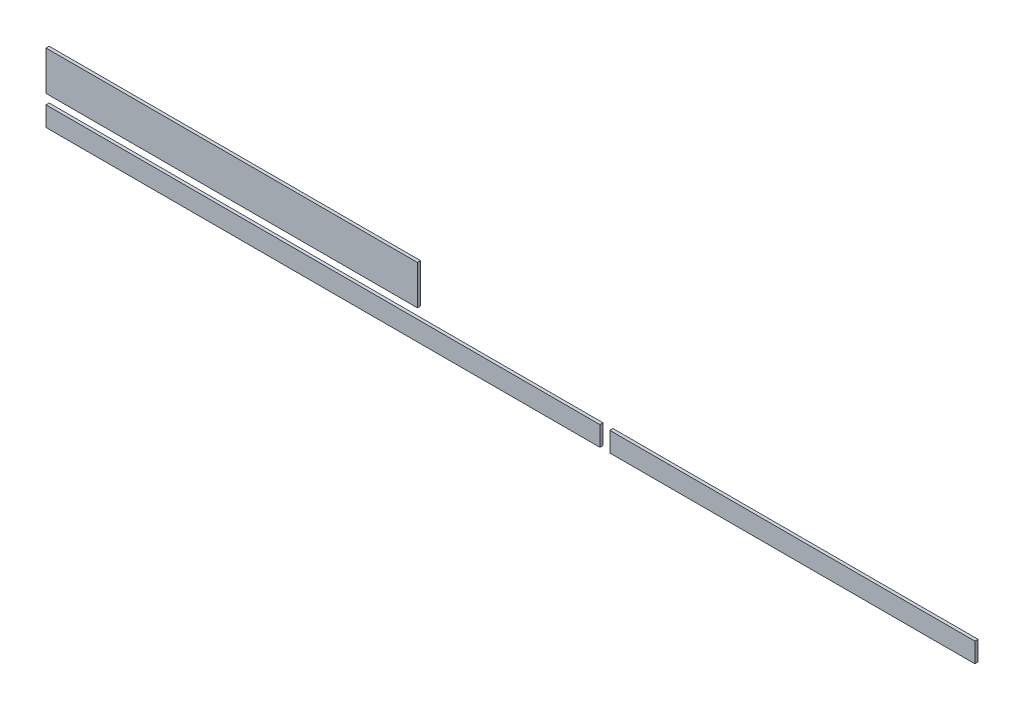
ISO-10303-21;
HEADER;
FILE_DESCRIPTION(('STEP AP214'),'2;1');
FILE_NAME('part.step','',(''),(''),'','','');
FILE_SCHEMA(('AUTOMOTIVE_DESIGN { 1 0 10303 214 1 1 1 1 }'));
ENDSEC;
DATA;
#1=APPLICATION_CONTEXT('core data for automotive mechanical design processes');
#2=APPLICATION_PROTOCOL_DEFINITION('international standard','automotive_design',2000,#1);
#3=PRODUCT_CONTEXT('',#1,'mechanical');
#4=PRODUCT('Part','Part','',(#3));
#5=PRODUCT_RELATED_PRODUCT_CATEGORY('part','',(#4));
#6=PRODUCT_DEFINITION_FORMATION('','',#4);
#7=PRODUCT_DEFINITION_CONTEXT('part definition',#1,'design');
#8=PRODUCT_DEFINITION('design','',#6,#7);
#9=PRODUCT_DEFINITION_SHAPE('','',#8);
#10=(LENGTH_UNIT() NAMED_UNIT(*) SI_UNIT(.MILLI.,.METRE.));
#11=(NAMED_UNIT(*) PLANE_ANGLE_UNIT() SI_UNIT($,.RADIAN.));
#12=(NAMED_UNIT(*) SI_UNIT($,.STERADIAN.) SOLID_ANGLE_UNIT());
#13=UNCERTAINTY_MEASURE_WITH_UNIT(LENGTH_MEASURE(1.E-05),#10,'distance_accuracy_value','');
#14=(GEOMETRIC_REPRESENTATION_CONTEXT(3) GLOBAL_UNCERTAINTY_ASSIGNED_CONTEXT((#13)) GLOBAL_UNIT_ASSIGNED_CONTEXT((#10,
#11,#12)) REPRESENTATION_CONTEXT('',''));
#15=CARTESIAN_POINT('',(0.,0.,0.));
#16=DIRECTION('',(0.,0.,1.));
#17=DIRECTION('',(1.,0.,0.));
#18=AXIS2_PLACEMENT_3D('',#15,#16,#17);
#19=CARTESIAN_POINT('',(0.,15.,1.5875));
#20=DIRECTION('',(1.,0.,0.));
#21=DIRECTION('',(0.,0.,-1.));
#22=AXIS2_PLACEMENT_3D('',#19,#20,#21);
#23=PLANE('',#22);
#24=DIRECTION('',(0.,-1.,0.));
#25=VECTOR('',#24,1.);
#26=CARTESIAN_POINT('',(0.,15.,0.));
#27=LINE('',#26,#25);
#28=CARTESIAN_POINT('',(0.,35.,0.));
#29=VERTEX_POINT('',#28);
#30=CARTESIAN_POINT('',(0.,15.,0.));
#31=VERTEX_POINT('',#30);
#32=EDGE_CURVE('E12',#29,#31,#27,.T.);
#33=ORIENTED_EDGE('',*,*,#32,.T.);
#34=DIRECTION('',(0.,0.,-1.));
#35=VECTOR('',#34,1.);
#36=CARTESIAN_POINT('',(0.,15.,1.5875));
#37=LINE('',#36,#35);
#38=CARTESIAN_POINT('',(0.,15.,1.5875));
#39=VERTEX_POINT('',#38);
#40=EDGE_CURVE('E136',#39,#31,#37,.T.);
#41=ORIENTED_EDGE('',*,*,#40,.F.);
#42=DIRECTION('',(0.,-1.,0.));
#43=VECTOR('',#42,1.);
#44=CARTESIAN_POINT('',(0.,15.,1.5875));
#45=LINE('',#44,#43);
#46=CARTESIAN_POINT('',(0.,35.,1.5875));
#47=VERTEX_POINT('',#46);
#48=EDGE_CURVE('E60',#47,#39,#45,.T.);
#49=ORIENTED_EDGE('',*,*,#48,.F.);
#50=DIRECTION('',(0.,0.,-1.));
#51=VECTOR('',#50,1.);
#52=CARTESIAN_POINT('',(0.,35.,1.5875));
#53=LINE('',#52,#51);
#54=EDGE_CURVE('E118',#47,#29,#53,.T.);
#55=ORIENTED_EDGE('',*,*,#54,.T.);
#56=EDGE_LOOP('',(#33,#41,#49,#55));
#57=FACE_BOUND('',#56,.T.);
#58=ADVANCED_FACE('F56',(#57),#23,.F.);
#59=CARTESIAN_POINT('',(188.71,15.,1.5875));
#60=DIRECTION('',(0.,1.,0.));
#61=DIRECTION('',(-1.,0.,0.));
#62=AXIS2_PLACEMENT_3D('',#59,#60,#61);
#63=PLANE('',#62);
#64=DIRECTION('',(1.,0.,0.));
#65=VECTOR('',#64,1.);
#66=CARTESIAN_POINT('',(188.71,15.,0.));
#67=LINE('',#66,#65);
#68=CARTESIAN_POINT('',(188.71,15.,0.));
#69=VERTEX_POINT('',#68);
#70=EDGE_CURVE('E67',#31,#69,#67,.T.);
#71=ORIENTED_EDGE('',*,*,#70,.T.);
#72=DIRECTION('',(0.,0.,-1.));
#73=VECTOR('',#72,1.);
#74=CARTESIAN_POINT('',(188.71,15.,1.5875));
#75=LINE('',#74,#73);
#76=CARTESIAN_POINT('',(188.71,15.,1.5875));
#77=VERTEX_POINT('',#76);
#78=EDGE_CURVE('E112',#77,#69,#75,.T.);
#79=ORIENTED_EDGE('',*,*,#78,.F.);
#80=DIRECTION('',(1.,0.,0.));
#81=VECTOR('',#80,1.);
#82=CARTESIAN_POINT('',(188.71,15.,1.5875));
#83=LINE('',#82,#81);
#84=EDGE_CURVE('E91',#39,#77,#83,.T.);
#85=ORIENTED_EDGE('',*,*,#84,.F.);
#86=ORIENTED_EDGE('',*,*,#40,.T.);
#87=EDGE_LOOP('',(#71,#79,#85,#86));
#88=FACE_BOUND('',#87,.T.);
#89=ADVANCED_FACE('F140',(#88),#63,.F.);
#90=CARTESIAN_POINT('',(188.71,15.,1.5875));
#91=DIRECTION('',(-1.,0.,0.));
#92=DIRECTION('',(0.,0.,1.));
#93=AXIS2_PLACEMENT_3D('',#90,#91,#92);
#94=PLANE('',#93);
#95=DIRECTION('',(0.,1.,0.));
#96=VECTOR('',#95,1.);
#97=CARTESIAN_POINT('',(188.71,15.,0.));
#98=LINE('',#97,#96);
#99=CARTESIAN_POINT('',(188.71,35.,0.));
#100=VERTEX_POINT('',#99);
#101=EDGE_CURVE('E107',#69,#100,#98,.T.);
#102=ORIENTED_EDGE('',*,*,#101,.T.);
#103=DIRECTION('',(0.,0.,-1.));
#104=VECTOR('',#103,1.);
#105=CARTESIAN_POINT('',(188.71,35.,1.5875));
#106=LINE('',#105,#104);
#107=CARTESIAN_POINT('',(188.71,35.,1.5875));
#108=VERTEX_POINT('',#107);
#109=EDGE_CURVE('E110',#108,#100,#106,.T.);
#110=ORIENTED_EDGE('',*,*,#109,.F.);
#111=DIRECTION('',(0.,1.,0.));
#112=VECTOR('',#111,1.);
#113=CARTESIAN_POINT('',(188.71,15.,1.5875));
#114=LINE('',#113,#112);
#115=EDGE_CURVE('E130',#77,#108,#114,.T.);
#116=ORIENTED_EDGE('',*,*,#115,.F.);
#117=ORIENTED_EDGE('',*,*,#78,.T.);
#118=EDGE_LOOP('',(#102,#110,#116,#117));
#119=FACE_BOUND('',#118,.T.);
#120=ADVANCED_FACE('F108',(#119),#94,.F.);
#121=CARTESIAN_POINT('',(188.71,35.,1.5875));
#122=DIRECTION('',(0.,-1.,0.));
#123=DIRECTION('',(1.,0.,0.));
#124=AXIS2_PLACEMENT_3D('',#121,#122,#123);
#125=PLANE('',#124);
#126=DIRECTION('',(-1.,0.,0.));
#127=VECTOR('',#126,1.);
#128=CARTESIAN_POINT('',(188.71,35.,0.));
#129=LINE('',#128,#127);
#130=EDGE_CURVE('E101',#100,#29,#129,.T.);
#131=ORIENTED_EDGE('',*,*,#130,.T.);
#132=ORIENTED_EDGE('',*,*,#54,.F.);
#133=DIRECTION('',(-1.,0.,0.));
#134=VECTOR('',#133,1.);
#135=CARTESIAN_POINT('',(188.71,35.,1.5875));
#136=LINE('',#135,#134);
#137=EDGE_CURVE('E116',#108,#47,#136,.T.);
#138=ORIENTED_EDGE('',*,*,#137,.F.);
#139=ORIENTED_EDGE('',*,*,#109,.T.);
#140=EDGE_LOOP('',(#131,#132,#138,#139));
#141=FACE_BOUND('',#140,.T.);
#142=ADVANCED_FACE('F115',(#141),#125,.F.);
#143=CARTESIAN_POINT('',(0.,0.,1.5875));
#144=DIRECTION('',(0.,0.,1.));
#145=DIRECTION('',(1.,0.,0.));
#146=AXIS2_PLACEMENT_3D('',#143,#144,#145);
#147=PLANE('',#146);
#148=ORIENTED_EDGE('',*,*,#48,.T.);
#149=ORIENTED_EDGE('',*,*,#84,.T.);
#150=ORIENTED_EDGE('',*,*,#115,.T.);
#151=ORIENTED_EDGE('',*,*,#137,.T.);
#152=EDGE_LOOP('',(#148,#149,#150,#151));
#153=FACE_BOUND('',#152,.T.);
#154=ADVANCED_FACE('F58',(#153),#147,.T.);
#155=CARTESIAN_POINT('',(0.,0.,0.));
#156=DIRECTION('',(0.,0.,1.));
#157=DIRECTION('',(1.,0.,0.));
#158=AXIS2_PLACEMENT_3D('',#155,#156,#157);
#159=PLANE('',#158);
#160=ORIENTED_EDGE('',*,*,#32,.F.);
#161=ORIENTED_EDGE('',*,*,#130,.F.);
#162=ORIENTED_EDGE('',*,*,#101,.F.);
#163=ORIENTED_EDGE('',*,*,#70,.F.);
#164=EDGE_LOOP('',(#160,#161,#162,#163));
#165=FACE_BOUND('',#164,.T.);
#166=ADVANCED_FACE('F120',(#165),#159,.F.);
#167=CLOSED_SHELL('',(#58,#89,#120,#142,#154,#166));
#168=MANIFOLD_SOLID_BREP('B2',#167);
#169=CARTESIAN_POINT('',(472.,0.,1.5875));
#170=DIRECTION('',(-1.,0.,0.));
#171=DIRECTION('',(0.,0.,1.));
#172=AXIS2_PLACEMENT_3D('',#169,#170,#171);
#173=PLANE('',#172);
#174=DIRECTION('',(0.,1.,0.));
#175=VECTOR('',#174,1.);
#176=CARTESIAN_POINT('',(472.,0.,0.));
#177=LINE('',#176,#175);
#178=CARTESIAN_POINT('',(472.,0.,0.));
#179=VERTEX_POINT('',#178);
#180=CARTESIAN_POINT('',(472.,10.,0.));
#181=VERTEX_POINT('',#180);
#182=EDGE_CURVE('E54',#179,#181,#177,.T.);
#183=ORIENTED_EDGE('',*,*,#182,.T.);
#184=DIRECTION('',(0.,0.,-1.));
#185=VECTOR('',#184,1.);
#186=CARTESIAN_POINT('',(472.,10.,1.5875));
#187=LINE('',#186,#185);
#188=CARTESIAN_POINT('',(472.,10.,1.5875));
#189=VERTEX_POINT('',#188);
#190=EDGE_CURVE('E272',#189,#181,#187,.T.);
#191=ORIENTED_EDGE('',*,*,#190,.F.);
#192=DIRECTION('',(0.,1.,0.));
#193=VECTOR('',#192,1.);
#194=CARTESIAN_POINT('',(472.,0.,1.5875));
#195=LINE('',#194,#193);
#196=CARTESIAN_POINT('',(472.,0.,1.5875));
#197=VERTEX_POINT('',#196);
#198=EDGE_CURVE('E205',#197,#189,#195,.T.);
#199=ORIENTED_EDGE('',*,*,#198,.F.);
#200=DIRECTION('',(0.,0.,-1.));
#201=VECTOR('',#200,1.);
#202=CARTESIAN_POINT('',(472.,0.,1.5875));
#203=LINE('',#202,#201);
#204=EDGE_CURVE('E260',#197,#179,#203,.T.);
#205=ORIENTED_EDGE('',*,*,#204,.T.);
#206=EDGE_LOOP('',(#183,#191,#199,#205));
#207=FACE_BOUND('',#206,.T.);
#208=ADVANCED_FACE('F201',(#207),#173,.F.);
#209=CARTESIAN_POINT('',(286.47,10.,1.5875));
#210=DIRECTION('',(0.,-1.,0.));
#211=DIRECTION('',(0.,0.,-1.));
#212=AXIS2_PLACEMENT_3D('',#209,#210,#211);
#213=PLANE('',#212);
#214=DIRECTION('',(-1.,0.,0.));
#215=VECTOR('',#214,1.);
#216=CARTESIAN_POINT('',(286.47,10.,0.));
#217=LINE('',#216,#215);
#218=CARTESIAN_POINT('',(286.47,10.,0.));
#219=VERTEX_POINT('',#218);
#220=EDGE_CURVE('E211',#181,#219,#217,.T.);
#221=ORIENTED_EDGE('',*,*,#220,.T.);
#222=DIRECTION('',(0.,0.,-1.));
#223=VECTOR('',#222,1.);
#224=CARTESIAN_POINT('',(286.47,10.,1.5875));
#225=LINE('',#224,#223);
#226=CARTESIAN_POINT('',(286.47,10.,1.5875));
#227=VERTEX_POINT('',#226);
#228=EDGE_CURVE('E256',#227,#219,#225,.T.);
#229=ORIENTED_EDGE('',*,*,#228,.F.);
#230=DIRECTION('',(-1.,0.,0.));
#231=VECTOR('',#230,1.);
#232=CARTESIAN_POINT('',(286.47,10.,1.5875));
#233=LINE('',#232,#231);
#234=EDGE_CURVE('E235',#189,#227,#233,.T.);
#235=ORIENTED_EDGE('',*,*,#234,.F.);
#236=ORIENTED_EDGE('',*,*,#190,.T.);
#237=EDGE_LOOP('',(#221,#229,#235,#236));
#238=FACE_BOUND('',#237,.T.);
#239=ADVANCED_FACE('F275',(#238),#213,.F.);
#240=CARTESIAN_POINT('',(286.47,0.,1.5875));
#241=DIRECTION('',(1.,0.,0.));
#242=DIRECTION('',(0.,0.,-1.));
#243=AXIS2_PLACEMENT_3D('',#240,#241,#242);
#244=PLANE('',#243);
#245=DIRECTION('',(0.,-1.,0.));
#246=VECTOR('',#245,1.);
#247=CARTESIAN_POINT('',(286.47,0.,0.));
#248=LINE('',#247,#246);
#249=CARTESIAN_POINT('',(286.47,0.,0.));
#250=VERTEX_POINT('',#249);
#251=EDGE_CURVE('E251',#219,#250,#248,.T.);
#252=ORIENTED_EDGE('',*,*,#251,.T.);
#253=DIRECTION('',(0.,0.,-1.));
#254=VECTOR('',#253,1.);
#255=CARTESIAN_POINT('',(286.47,0.,1.5875));
#256=LINE('',#255,#254);
#257=CARTESIAN_POINT('',(286.47,0.,1.5875));
#258=VERTEX_POINT('',#257);
#259=EDGE_CURVE('E254',#258,#250,#256,.T.);
#260=ORIENTED_EDGE('',*,*,#259,.F.);
#261=DIRECTION('',(0.,-1.,0.));
#262=VECTOR('',#261,1.);
#263=CARTESIAN_POINT('',(286.47,0.,1.5875));
#264=LINE('',#263,#262);
#265=EDGE_CURVE('E268',#227,#258,#264,.T.);
#266=ORIENTED_EDGE('',*,*,#265,.F.);
#267=ORIENTED_EDGE('',*,*,#228,.T.);
#268=EDGE_LOOP('',(#252,#260,#266,#267));
#269=FACE_BOUND('',#268,.T.);
#270=ADVANCED_FACE('F252',(#269),#244,.F.);
#271=CARTESIAN_POINT('',(286.47,0.,1.5875));
#272=DIRECTION('',(0.,1.,0.));
#273=DIRECTION('',(0.,0.,1.));
#274=AXIS2_PLACEMENT_3D('',#271,#272,#273);
#275=PLANE('',#274);
#276=DIRECTION('',(1.,0.,0.));
#277=VECTOR('',#276,1.);
#278=CARTESIAN_POINT('',(286.47,0.,0.));
#279=LINE('',#278,#277);
#280=EDGE_CURVE('E245',#250,#179,#279,.T.);
#281=ORIENTED_EDGE('',*,*,#280,.T.);
#282=ORIENTED_EDGE('',*,*,#204,.F.);
#283=DIRECTION('',(1.,0.,0.));
#284=VECTOR('',#283,1.);
#285=CARTESIAN_POINT('',(286.47,0.,1.5875));
#286=LINE('',#285,#284);
#287=EDGE_CURVE('E259',#258,#197,#286,.T.);
#288=ORIENTED_EDGE('',*,*,#287,.F.);
#289=ORIENTED_EDGE('',*,*,#259,.T.);
#290=EDGE_LOOP('',(#281,#282,#288,#289));
#291=FACE_BOUND('',#290,.T.);
#292=ADVANCED_FACE('F258',(#291),#275,.F.);
#293=CARTESIAN_POINT('',(0.,0.,1.5875));
#294=DIRECTION('',(0.,0.,-1.));
#295=DIRECTION('',(-1.,0.,0.));
#296=AXIS2_PLACEMENT_3D('',#293,#294,#295);
#297=PLANE('',#296);
#298=ORIENTED_EDGE('',*,*,#198,.T.);
#299=ORIENTED_EDGE('',*,*,#234,.T.);
#300=ORIENTED_EDGE('',*,*,#265,.T.);
#301=ORIENTED_EDGE('',*,*,#287,.T.);
#302=EDGE_LOOP('',(#298,#299,#300,#301));
#303=FACE_BOUND('',#302,.T.);
#304=ADVANCED_FACE('F203',(#303),#297,.F.);
#305=CARTESIAN_POINT('',(0.,0.,0.));
#306=DIRECTION('',(0.,0.,-1.));
#307=DIRECTION('',(-1.,0.,0.));
#308=AXIS2_PLACEMENT_3D('',#305,#306,#307);
#309=PLANE('',#308);
#310=ORIENTED_EDGE('',*,*,#182,.F.);
#311=ORIENTED_EDGE('',*,*,#280,.F.);
#312=ORIENTED_EDGE('',*,*,#251,.F.);
#313=ORIENTED_EDGE('',*,*,#220,.F.);
#314=EDGE_LOOP('',(#310,#311,#312,#313));
#315=FACE_BOUND('',#314,.T.);
#316=ADVANCED_FACE('F262',(#315),#309,.T.);
#317=CLOSED_SHELL('',(#208,#239,#270,#292,#304,#316));
#318=MANIFOLD_SOLID_BREP('B6',#317);
#319=CARTESIAN_POINT('',(281.47,10.,1.5875));
#320=DIRECTION('',(-1.,0.,0.));
#321=DIRECTION('',(0.,0.,1.));
#322=AXIS2_PLACEMENT_3D('',#319,#320,#321);
#323=PLANE('',#322);
#324=DIRECTION('',(0.,1.,0.));
#325=VECTOR('',#324,1.);
#326=CARTESIAN_POINT('',(281.47,10.,0.));
#327=LINE('',#326,#325);
#328=CARTESIAN_POINT('',(281.47,0.,0.));
#329=VERTEX_POINT('',#328);
#330=CARTESIAN_POINT('',(281.47,10.,0.));
#331=VERTEX_POINT('',#330);
#332=EDGE_CURVE('E388',#329,#331,#327,.T.);
#333=ORIENTED_EDGE('',*,*,#332,.T.);
#334=DIRECTION('',(0.,0.,-1.));
#335=VECTOR('',#334,1.);
#336=CARTESIAN_POINT('',(281.47,10.,1.5875));
#337=LINE('',#336,#335);
#338=CARTESIAN_POINT('',(281.47,10.,1.5875));
#339=VERTEX_POINT('',#338);
#340=EDGE_CURVE('E199',#339,#331,#337,.T.);
#341=ORIENTED_EDGE('',*,*,#340,.F.);
#342=DIRECTION('',(0.,1.,0.));
#343=VECTOR('',#342,1.);
#344=CARTESIAN_POINT('',(281.47,10.,1.5875));
#345=LINE('',#344,#343);
#346=CARTESIAN_POINT('',(281.47,0.,1.5875));
#347=VERTEX_POINT('',#346);
#348=EDGE_CURVE('E376',#347,#339,#345,.T.);
#349=ORIENTED_EDGE('',*,*,#348,.F.);
#350=DIRECTION('',(0.,0.,-1.));
#351=VECTOR('',#350,1.);
#352=CARTESIAN_POINT('',(281.47,0.,1.5875));
#353=LINE('',#352,#351);
#354=EDGE_CURVE('E384',#347,#329,#353,.T.);
#355=ORIENTED_EDGE('',*,*,#354,.T.);
#356=EDGE_LOOP('',(#333,#341,#349,#355));
#357=FACE_BOUND('',#356,.T.);
#358=ADVANCED_FACE('F325',(#357),#323,.F.);
#359=CARTESIAN_POINT('',(0.,10.,1.5875));
#360=DIRECTION('',(0.,-1.,0.));
#361=DIRECTION('',(0.,0.,-1.));
#362=AXIS2_PLACEMENT_3D('',#359,#360,#361);
#363=PLANE('',#362);
#364=DIRECTION('',(-1.,0.,0.));
#365=VECTOR('',#364,1.);
#366=CARTESIAN_POINT('',(0.,10.,0.));
#367=LINE('',#366,#365);
#368=CARTESIAN_POINT('',(0.,10.,0.));
#369=VERTEX_POINT('',#368);
#370=EDGE_CURVE('E380',#331,#369,#367,.T.);
#371=ORIENTED_EDGE('',*,*,#370,.T.);
#372=DIRECTION('',(0.,0.,-1.));
#373=VECTOR('',#372,1.);
#374=CARTESIAN_POINT('',(0.,10.,1.5875));
#375=LINE('',#374,#373);
#376=CARTESIAN_POINT('',(0.,10.,1.5875));
#377=VERTEX_POINT('',#376);
#378=EDGE_CURVE('E333',#377,#369,#375,.T.);
#379=ORIENTED_EDGE('',*,*,#378,.F.);
#380=DIRECTION('',(-1.,0.,0.));
#381=VECTOR('',#380,1.);
#382=CARTESIAN_POINT('',(0.,10.,1.5875));
#383=LINE('',#382,#381);
#384=EDGE_CURVE('E371',#339,#377,#383,.T.);
#385=ORIENTED_EDGE('',*,*,#384,.F.);
#386=ORIENTED_EDGE('',*,*,#340,.T.);
#387=EDGE_LOOP('',(#371,#379,#385,#386));
#388=FACE_BOUND('',#387,.T.);
#389=ADVANCED_FACE('F379',(#388),#363,.F.);
#390=CARTESIAN_POINT('',(0.,10.,1.5875));
#391=DIRECTION('',(1.,0.,0.));
#392=DIRECTION('',(0.,0.,-1.));
#393=AXIS2_PLACEMENT_3D('',#390,#391,#392);
#394=PLANE('',#393);
#395=DIRECTION('',(0.,-1.,0.));
#396=VECTOR('',#395,1.);
#397=CARTESIAN_POINT('',(0.,10.,0.));
#398=LINE('',#397,#396);
#399=CARTESIAN_POINT('',(0.,0.,0.));
#400=VERTEX_POINT('',#399);
#401=EDGE_CURVE('E358',#369,#400,#398,.T.);
#402=ORIENTED_EDGE('',*,*,#401,.T.);
#403=DIRECTION('',(0.,0.,-1.));
#404=VECTOR('',#403,1.);
#405=CARTESIAN_POINT('',(0.,0.,1.5875));
#406=LINE('',#405,#404);
#407=CARTESIAN_POINT('',(0.,0.,1.5875));
#408=VERTEX_POINT('',#407);
#409=EDGE_CURVE('E381',#408,#400,#406,.T.);
#410=ORIENTED_EDGE('',*,*,#409,.F.);
#411=DIRECTION('',(0.,-1.,0.));
#412=VECTOR('',#411,1.);
#413=CARTESIAN_POINT('',(0.,10.,1.5875));
#414=LINE('',#413,#412);
#415=EDGE_CURVE('E374',#377,#408,#414,.T.);
#416=ORIENTED_EDGE('',*,*,#415,.F.);
#417=ORIENTED_EDGE('',*,*,#378,.T.);
#418=EDGE_LOOP('',(#402,#410,#416,#417));
#419=FACE_BOUND('',#418,.T.);
#420=ADVANCED_FACE('F382',(#419),#394,.F.);
#421=CARTESIAN_POINT('',(0.,0.,1.5875));
#422=DIRECTION('',(0.,1.,0.));
#423=DIRECTION('',(0.,0.,1.));
#424=AXIS2_PLACEMENT_3D('',#421,#422,#423);
#425=PLANE('',#424);
#426=DIRECTION('',(1.,0.,0.));
#427=VECTOR('',#426,1.);
#428=CARTESIAN_POINT('',(0.,0.,0.));
#429=LINE('',#428,#427);
#430=EDGE_CURVE('E364',#400,#329,#429,.T.);
#431=ORIENTED_EDGE('',*,*,#430,.T.);
#432=ORIENTED_EDGE('',*,*,#354,.F.);
#433=DIRECTION('',(1.,0.,0.));
#434=VECTOR('',#433,1.);
#435=CARTESIAN_POINT('',(0.,0.,1.5875));
#436=LINE('',#435,#434);
#437=EDGE_CURVE('E341',#408,#347,#436,.T.);
#438=ORIENTED_EDGE('',*,*,#437,.F.);
#439=ORIENTED_EDGE('',*,*,#409,.T.);
#440=EDGE_LOOP('',(#431,#432,#438,#439));
#441=FACE_BOUND('',#440,.T.);
#442=ADVANCED_FACE('F395',(#441),#425,.F.);
#443=CARTESIAN_POINT('',(0.,0.,1.5875));
#444=DIRECTION('',(0.,0.,1.));
#445=DIRECTION('',(1.,0.,0.));
#446=AXIS2_PLACEMENT_3D('',#443,#444,#445);
#447=PLANE('',#446);
#448=ORIENTED_EDGE('',*,*,#348,.T.);
#449=ORIENTED_EDGE('',*,*,#384,.T.);
#450=ORIENTED_EDGE('',*,*,#415,.T.);
#451=ORIENTED_EDGE('',*,*,#437,.T.);
#452=EDGE_LOOP('',(#448,#449,#450,#451));
#453=FACE_BOUND('',#452,.T.);
#454=ADVANCED_FACE('F372',(#453),#447,.T.);
#455=CARTESIAN_POINT('',(0.,0.,0.));
#456=DIRECTION('',(0.,0.,1.));
#457=DIRECTION('',(1.,0.,0.));
#458=AXIS2_PLACEMENT_3D('',#455,#456,#457);
#459=PLANE('',#458);
#460=ORIENTED_EDGE('',*,*,#332,.F.);
#461=ORIENTED_EDGE('',*,*,#430,.F.);
#462=ORIENTED_EDGE('',*,*,#401,.F.);
#463=ORIENTED_EDGE('',*,*,#370,.F.);
#464=EDGE_LOOP('',(#460,#461,#462,#463));
#465=FACE_BOUND('',#464,.T.);
#466=ADVANCED_FACE('F398',(#465),#459,.F.);
#467=CLOSED_SHELL('',(#358,#389,#420,#442,#454,#466));
#468=MANIFOLD_SOLID_BREP('B48',#467);
#469=ADVANCED_BREP_SHAPE_REPRESENTATION('',(#18,#168,#318,#468),#14);
#470=SHAPE_DEFINITION_REPRESENTATION(#9,#469);
ENDSEC;
END-ISO-10303-21;
